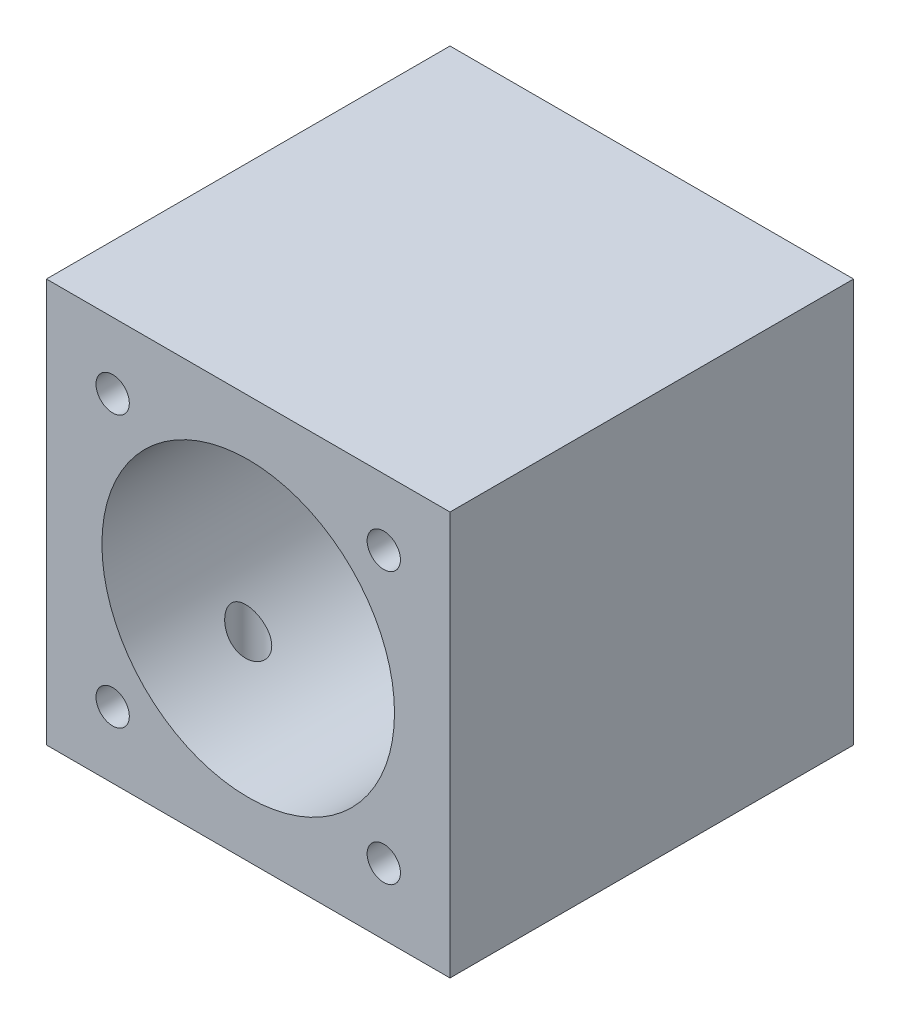
ISO-10303-21;
HEADER;
FILE_DESCRIPTION(('STEP AP214'),'2;1');
FILE_NAME('part.step','',(''),(''),'','','');
FILE_SCHEMA(('AUTOMOTIVE_DESIGN { 1 0 10303 214 1 1 1 1 }'));
ENDSEC;
DATA;
#1=APPLICATION_CONTEXT('core data for automotive mechanical design processes');
#2=APPLICATION_PROTOCOL_DEFINITION('international standard','automotive_design',2000,#1);
#3=PRODUCT_CONTEXT('',#1,'mechanical');
#4=PRODUCT('Part','Part','',(#3));
#5=PRODUCT_RELATED_PRODUCT_CATEGORY('part','',(#4));
#6=PRODUCT_DEFINITION_FORMATION('','',#4);
#7=PRODUCT_DEFINITION_CONTEXT('part definition',#1,'design');
#8=PRODUCT_DEFINITION('design','',#6,#7);
#9=PRODUCT_DEFINITION_SHAPE('','',#8);
#10=(LENGTH_UNIT() NAMED_UNIT(*) SI_UNIT(.MILLI.,.METRE.));
#11=(NAMED_UNIT(*) PLANE_ANGLE_UNIT() SI_UNIT($,.RADIAN.));
#12=(NAMED_UNIT(*) SI_UNIT($,.STERADIAN.) SOLID_ANGLE_UNIT());
#13=UNCERTAINTY_MEASURE_WITH_UNIT(LENGTH_MEASURE(1.E-05),#10,'distance_accuracy_value','');
#14=(GEOMETRIC_REPRESENTATION_CONTEXT(3) GLOBAL_UNCERTAINTY_ASSIGNED_CONTEXT((#13)) GLOBAL_UNIT_ASSIGNED_CONTEXT((#10,
#11,#12)) REPRESENTATION_CONTEXT('',''));
#15=CARTESIAN_POINT('',(0.,0.,0.));
#16=DIRECTION('',(0.,0.,1.));
#17=DIRECTION('',(1.,0.,0.));
#18=AXIS2_PLACEMENT_3D('',#15,#16,#17);
#19=CARTESIAN_POINT('',(0.,0.,40.));
#20=DIRECTION('',(0.,0.,1.));
#21=DIRECTION('',(1.,0.,0.));
#22=AXIS2_PLACEMENT_3D('',#19,#20,#21);
#23=PLANE('',#22);
#24=CARTESIAN_POINT('',(-13.4350288425444,13.4350288425444,40.));
#25=DIRECTION('',(0.,0.,1.));
#26=DIRECTION('',(1.,0.,0.));
#27=AXIS2_PLACEMENT_3D('',#24,#25,#26);
#28=CIRCLE('',#27,1.64999999999999);
#29=CARTESIAN_POINT('',(-11.7850288425444,13.4350288425444,40.));
#30=VERTEX_POINT('',#29);
#31=EDGE_CURVE('E112',#30,#30,#28,.T.);
#32=ORIENTED_EDGE('',*,*,#31,.F.);
#33=EDGE_LOOP('',(#32));
#34=FACE_BOUND('',#33,.T.);
#35=CARTESIAN_POINT('',(13.4350288425444,13.4350288425444,40.));
#36=DIRECTION('',(0.,0.,1.));
#37=DIRECTION('',(1.,0.,0.));
#38=AXIS2_PLACEMENT_3D('',#35,#36,#37);
#39=CIRCLE('',#38,1.64999999999999);
#40=CARTESIAN_POINT('',(15.0850288425444,13.4350288425444,40.));
#41=VERTEX_POINT('',#40);
#42=EDGE_CURVE('E111',#41,#41,#39,.T.);
#43=ORIENTED_EDGE('',*,*,#42,.F.);
#44=EDGE_LOOP('',(#43));
#45=FACE_BOUND('',#44,.T.);
#46=CARTESIAN_POINT('',(13.4350288425444,-13.4350288425444,40.));
#47=DIRECTION('',(0.,0.,1.));
#48=DIRECTION('',(1.,0.,0.));
#49=AXIS2_PLACEMENT_3D('',#46,#47,#48);
#50=CIRCLE('',#49,1.64999999999999);
#51=CARTESIAN_POINT('',(15.0850288425444,-13.4350288425444,40.));
#52=VERTEX_POINT('',#51);
#53=EDGE_CURVE('E124',#52,#52,#50,.T.);
#54=ORIENTED_EDGE('',*,*,#53,.F.);
#55=EDGE_LOOP('',(#54));
#56=FACE_BOUND('',#55,.T.);
#57=CARTESIAN_POINT('',(-13.4350288425444,-13.4350288425444,40.));
#58=DIRECTION('',(0.,0.,1.));
#59=DIRECTION('',(1.,0.,0.));
#60=AXIS2_PLACEMENT_3D('',#57,#58,#59);
#61=CIRCLE('',#60,1.64999999999999);
#62=CARTESIAN_POINT('',(-11.7850288425444,-13.4350288425444,40.));
#63=VERTEX_POINT('',#62);
#64=EDGE_CURVE('E130',#63,#63,#61,.T.);
#65=ORIENTED_EDGE('',*,*,#64,.F.);
#66=EDGE_LOOP('',(#65));
#67=FACE_BOUND('',#66,.T.);
#68=DIRECTION('',(0.,-1.,0.));
#69=VECTOR('',#68,1.);
#70=CARTESIAN_POINT('',(-20.,-20.,40.));
#71=LINE('',#70,#69);
#72=CARTESIAN_POINT('',(-20.,20.,40.));
#73=VERTEX_POINT('',#72);
#74=CARTESIAN_POINT('',(-20.,-20.,40.));
#75=VERTEX_POINT('',#74);
#76=EDGE_CURVE('E143',#73,#75,#71,.T.);
#77=ORIENTED_EDGE('',*,*,#76,.T.);
#78=DIRECTION('',(1.,0.,0.));
#79=VECTOR('',#78,1.);
#80=CARTESIAN_POINT('',(20.,-20.,40.));
#81=LINE('',#80,#79);
#82=CARTESIAN_POINT('',(20.,-20.,40.));
#83=VERTEX_POINT('',#82);
#84=EDGE_CURVE('E88',#75,#83,#81,.T.);
#85=ORIENTED_EDGE('',*,*,#84,.T.);
#86=DIRECTION('',(0.,1.,0.));
#87=VECTOR('',#86,1.);
#88=CARTESIAN_POINT('',(20.,-20.,40.));
#89=LINE('',#88,#87);
#90=CARTESIAN_POINT('',(20.,20.,40.));
#91=VERTEX_POINT('',#90);
#92=EDGE_CURVE('E146',#83,#91,#89,.T.);
#93=ORIENTED_EDGE('',*,*,#92,.T.);
#94=DIRECTION('',(-1.,0.,0.));
#95=VECTOR('',#94,1.);
#96=CARTESIAN_POINT('',(20.,20.,40.));
#97=LINE('',#96,#95);
#98=EDGE_CURVE('E57',#91,#73,#97,.T.);
#99=ORIENTED_EDGE('',*,*,#98,.T.);
#100=EDGE_LOOP('',(#77,#85,#93,#99));
#101=FACE_BOUND('',#100,.T.);
#102=CARTESIAN_POINT('',(0.,0.,40.));
#103=DIRECTION('',(0.,0.,1.));
#104=DIRECTION('',(1.,0.,0.));
#105=AXIS2_PLACEMENT_3D('',#102,#103,#104);
#106=CIRCLE('',#105,14.5);
#107=CARTESIAN_POINT('',(14.5,0.,40.));
#108=VERTEX_POINT('',#107);
#109=EDGE_CURVE('E137',#108,#108,#106,.T.);
#110=ORIENTED_EDGE('',*,*,#109,.F.);
#111=EDGE_LOOP('',(#110));
#112=FACE_BOUND('',#111,.T.);
#113=ADVANCED_FACE('F34',(#34,#45,#56,#67,#101,#112),#23,.T.);
#114=CARTESIAN_POINT('',(0.,0.,0.));
#115=DIRECTION('',(0.,0.,1.));
#116=DIRECTION('',(1.,0.,0.));
#117=AXIS2_PLACEMENT_3D('',#114,#115,#116);
#118=PLANE('',#117);
#119=DIRECTION('',(0.,-1.,0.));
#120=VECTOR('',#119,1.);
#121=CARTESIAN_POINT('',(-20.,-20.,0.));
#122=LINE('',#121,#120);
#123=CARTESIAN_POINT('',(-20.,20.,0.));
#124=VERTEX_POINT('',#123);
#125=CARTESIAN_POINT('',(-20.,-20.,0.));
#126=VERTEX_POINT('',#125);
#127=EDGE_CURVE('E140',#124,#126,#122,.T.);
#128=ORIENTED_EDGE('',*,*,#127,.F.);
#129=DIRECTION('',(-1.,0.,0.));
#130=VECTOR('',#129,1.);
#131=CARTESIAN_POINT('',(20.,20.,0.));
#132=LINE('',#131,#130);
#133=CARTESIAN_POINT('',(20.,20.,0.));
#134=VERTEX_POINT('',#133);
#135=EDGE_CURVE('E81',#134,#124,#132,.T.);
#136=ORIENTED_EDGE('',*,*,#135,.F.);
#137=DIRECTION('',(0.,1.,0.));
#138=VECTOR('',#137,1.);
#139=CARTESIAN_POINT('',(20.,-20.,0.));
#140=LINE('',#139,#138);
#141=CARTESIAN_POINT('',(20.,-20.,0.));
#142=VERTEX_POINT('',#141);
#143=EDGE_CURVE('E75',#142,#134,#140,.T.);
#144=ORIENTED_EDGE('',*,*,#143,.F.);
#145=DIRECTION('',(1.,0.,0.));
#146=VECTOR('',#145,1.);
#147=CARTESIAN_POINT('',(20.,-20.,0.));
#148=LINE('',#147,#146);
#149=EDGE_CURVE('E152',#126,#142,#148,.T.);
#150=ORIENTED_EDGE('',*,*,#149,.F.);
#151=EDGE_LOOP('',(#128,#136,#144,#150));
#152=FACE_BOUND('',#151,.T.);
#153=CARTESIAN_POINT('',(0.,0.,0.));
#154=DIRECTION('',(0.,0.,1.));
#155=DIRECTION('',(1.,0.,0.));
#156=AXIS2_PLACEMENT_3D('',#153,#154,#155);
#157=CIRCLE('',#156,14.5);
#158=CARTESIAN_POINT('',(14.5,0.,0.));
#159=VERTEX_POINT('',#158);
#160=EDGE_CURVE('E136',#159,#159,#157,.T.);
#161=ORIENTED_EDGE('',*,*,#160,.T.);
#162=EDGE_LOOP('',(#161));
#163=FACE_BOUND('',#162,.T.);
#164=ADVANCED_FACE('F212',(#152,#163),#118,.F.);
#165=CARTESIAN_POINT('',(-20.,-20.,40.));
#166=DIRECTION('',(1.,0.,0.));
#167=DIRECTION('',(0.,0.,-1.));
#168=AXIS2_PLACEMENT_3D('',#165,#166,#167);
#169=PLANE('',#168);
#170=ORIENTED_EDGE('',*,*,#127,.T.);
#171=DIRECTION('',(0.,0.,-1.));
#172=VECTOR('',#171,1.);
#173=CARTESIAN_POINT('',(-20.,-20.,40.));
#174=LINE('',#173,#172);
#175=EDGE_CURVE('E11',#75,#126,#174,.T.);
#176=ORIENTED_EDGE('',*,*,#175,.F.);
#177=ORIENTED_EDGE('',*,*,#76,.F.);
#178=DIRECTION('',(0.,0.,-1.));
#179=VECTOR('',#178,1.);
#180=CARTESIAN_POINT('',(-20.,20.,40.));
#181=LINE('',#180,#179);
#182=EDGE_CURVE('E149',#73,#124,#181,.T.);
#183=ORIENTED_EDGE('',*,*,#182,.T.);
#184=EDGE_LOOP('',(#170,#176,#177,#183));
#185=FACE_BOUND('',#184,.T.);
#186=ADVANCED_FACE('F36',(#185),#169,.F.);
#187=CARTESIAN_POINT('',(20.,-20.,40.));
#188=DIRECTION('',(0.,1.,0.));
#189=DIRECTION('',(-1.,0.,0.));
#190=AXIS2_PLACEMENT_3D('',#187,#188,#189);
#191=PLANE('',#190);
#192=CARTESIAN_POINT('',(-9.99999999999999,-20.,30.));
#193=DIRECTION('',(0.,-1.,0.));
#194=DIRECTION('',(0.,0.,-1.));
#195=AXIS2_PLACEMENT_3D('',#192,#193,#194);
#196=CIRCLE('',#195,1.64999999999999);
#197=CARTESIAN_POINT('',(-9.99999999999999,-20.,28.35));
#198=VERTEX_POINT('',#197);
#199=EDGE_CURVE('E236',#198,#198,#196,.T.);
#200=ORIENTED_EDGE('',*,*,#199,.F.);
#201=EDGE_LOOP('',(#200));
#202=FACE_BOUND('',#201,.T.);
#203=CARTESIAN_POINT('',(10.,-20.,30.));
#204=DIRECTION('',(0.,-1.,0.));
#205=DIRECTION('',(0.,0.,-1.));
#206=AXIS2_PLACEMENT_3D('',#203,#204,#205);
#207=CIRCLE('',#206,1.64999999999999);
#208=CARTESIAN_POINT('',(10.,-20.,28.35));
#209=VERTEX_POINT('',#208);
#210=EDGE_CURVE('E240',#209,#209,#207,.T.);
#211=ORIENTED_EDGE('',*,*,#210,.F.);
#212=EDGE_LOOP('',(#211));
#213=FACE_BOUND('',#212,.T.);
#214=CARTESIAN_POINT('',(10.,-20.,10.));
#215=DIRECTION('',(0.,-1.,0.));
#216=DIRECTION('',(0.,0.,-1.));
#217=AXIS2_PLACEMENT_3D('',#214,#215,#216);
#218=CIRCLE('',#217,1.64999999999999);
#219=CARTESIAN_POINT('',(10.,-20.,8.35000000000001));
#220=VERTEX_POINT('',#219);
#221=EDGE_CURVE('E244',#220,#220,#218,.T.);
#222=ORIENTED_EDGE('',*,*,#221,.F.);
#223=EDGE_LOOP('',(#222));
#224=FACE_BOUND('',#223,.T.);
#225=CARTESIAN_POINT('',(-9.99999999999999,-20.,10.));
#226=DIRECTION('',(0.,-1.,0.));
#227=DIRECTION('',(0.,0.,-1.));
#228=AXIS2_PLACEMENT_3D('',#225,#226,#227);
#229=CIRCLE('',#228,1.64999999999999);
#230=CARTESIAN_POINT('',(-9.99999999999999,-20.,8.35000000000001));
#231=VERTEX_POINT('',#230);
#232=EDGE_CURVE('E165',#231,#231,#229,.T.);
#233=ORIENTED_EDGE('',*,*,#232,.F.);
#234=EDGE_LOOP('',(#233));
#235=FACE_BOUND('',#234,.T.);
#236=ORIENTED_EDGE('',*,*,#149,.T.);
#237=DIRECTION('',(0.,0.,-1.));
#238=VECTOR('',#237,1.);
#239=CARTESIAN_POINT('',(20.,-20.,40.));
#240=LINE('',#239,#238);
#241=EDGE_CURVE('E48',#83,#142,#240,.T.);
#242=ORIENTED_EDGE('',*,*,#241,.F.);
#243=ORIENTED_EDGE('',*,*,#84,.F.);
#244=ORIENTED_EDGE('',*,*,#175,.T.);
#245=EDGE_LOOP('',(#236,#242,#243,#244));
#246=FACE_BOUND('',#245,.T.);
#247=ADVANCED_FACE('F226',(#202,#213,#224,#235,#246),#191,.F.);
#248=CARTESIAN_POINT('',(20.,-20.,40.));
#249=DIRECTION('',(-1.,0.,0.));
#250=DIRECTION('',(0.,0.,1.));
#251=AXIS2_PLACEMENT_3D('',#248,#249,#250);
#252=PLANE('',#251);
#253=ORIENTED_EDGE('',*,*,#143,.T.);
#254=DIRECTION('',(0.,0.,-1.));
#255=VECTOR('',#254,1.);
#256=CARTESIAN_POINT('',(20.,20.,40.));
#257=LINE('',#256,#255);
#258=EDGE_CURVE('E157',#91,#134,#257,.T.);
#259=ORIENTED_EDGE('',*,*,#258,.F.);
#260=ORIENTED_EDGE('',*,*,#92,.F.);
#261=ORIENTED_EDGE('',*,*,#241,.T.);
#262=EDGE_LOOP('',(#253,#259,#260,#261));
#263=FACE_BOUND('',#262,.T.);
#264=ADVANCED_FACE('F224',(#263),#252,.F.);
#265=CARTESIAN_POINT('',(20.,20.,40.));
#266=DIRECTION('',(0.,-1.,0.));
#267=DIRECTION('',(1.,0.,0.));
#268=AXIS2_PLACEMENT_3D('',#265,#266,#267);
#269=PLANE('',#268);
#270=ORIENTED_EDGE('',*,*,#135,.T.);
#271=ORIENTED_EDGE('',*,*,#182,.F.);
#272=ORIENTED_EDGE('',*,*,#98,.F.);
#273=ORIENTED_EDGE('',*,*,#258,.T.);
#274=EDGE_LOOP('',(#270,#271,#272,#273));
#275=FACE_BOUND('',#274,.T.);
#276=ADVANCED_FACE('F208',(#275),#269,.F.);
#277=CARTESIAN_POINT('',(0.,0.,40.));
#278=DIRECTION('',(0.,0.,-1.));
#279=DIRECTION('',(-1.,0.,0.));
#280=AXIS2_PLACEMENT_3D('',#277,#278,#279);
#281=CYLINDRICAL_SURFACE('',#280,14.5);
#282=CARTESIAN_POINT('',(-9.99999999999999,-10.5,28.35));
#283=CARTESIAN_POINT('',(-10.1313534560671,-10.3748929121296,28.349995807328));
#284=CARTESIAN_POINT('',(-10.260506336877,-10.2471379112481,28.36564001975));
#285=CARTESIAN_POINT('',(-10.4480658163352,-10.054654863528,28.4106945426634));
#286=CARTESIAN_POINT('',(-10.5096729191813,-9.99022393603448,28.429369147471));
#287=CARTESIAN_POINT('',(-10.6304712227531,-9.86158468853992,28.4738468208631));
#288=CARTESIAN_POINT('',(-10.689663202446,-9.79737630297366,28.4996475698041));
#289=CARTESIAN_POINT('',(-10.8429000826233,-9.62816807877147,28.5775035449051));
#290=CARTESIAN_POINT('',(-10.934616446082,-9.52375580876354,28.6357278032631));
#291=CARTESIAN_POINT('',(-11.0647771122063,-9.37151002497984,28.7383409535363));
#292=CARTESIAN_POINT('',(-11.1068943759035,-9.32153247007461,28.77505226862));
#293=CARTESIAN_POINT('',(-11.1883325525917,-9.22362474750031,28.8538860815675));
#294=CARTESIAN_POINT('',(-11.2276550175896,-9.17569344950437,28.8960055391267));
#295=CARTESIAN_POINT('',(-11.3102501322488,-9.07377123632893,28.994689643744));
#296=CARTESIAN_POINT('',(-11.3528308105908,-9.02038472582194,29.0524749476392));
#297=CARTESIAN_POINT('',(-11.4319810234612,-8.9198591336061,29.1769818928109));
#298=CARTESIAN_POINT('',(-11.468557439587,-8.87271291196565,29.2436931423872));
#299=CARTESIAN_POINT('',(-11.5262164404264,-8.7976158257526,29.3700687219737));
#300=CARTESIAN_POINT('',(-11.5489280172526,-8.76774349535401,29.4278302347267));
#301=CARTESIAN_POINT('',(-11.5883248426558,-8.7156065864995,29.5486246769218));
#302=CARTESIAN_POINT('',(-11.6050196526374,-8.69332994060341,29.6116490449194));
#303=CARTESIAN_POINT('',(-11.628824099162,-8.66145372662411,29.7307942784749));
#304=CARTESIAN_POINT('',(-11.6370779964464,-8.65034642596195,29.7862774507427));
#305=CARTESIAN_POINT('',(-11.6478595234522,-8.63582390704461,29.8987852516419));
#306=CARTESIAN_POINT('',(-11.6503912373791,-8.63240320249523,29.9558087514285));
#307=CARTESIAN_POINT('',(-11.6495096163091,-8.63359286513653,30.0697716814279));
#308=CARTESIAN_POINT('',(-11.6460912446196,-8.63821003631518,30.1267109995424));
#309=CARTESIAN_POINT('',(-11.6336017955209,-8.65502251350994,30.2388209083442));
#310=CARTESIAN_POINT('',(-11.6245263724234,-8.66722364542593,30.2939901049524));
#311=CARTESIAN_POINT('',(-11.5984189700136,-8.70214108714271,30.4151086605549));
#312=CARTESIAN_POINT('',(-11.5799434814787,-8.72675147143607,30.4801947782875));
#313=CARTESIAN_POINT('',(-11.53668456798,-8.78385981504646,30.6045308455615));
#314=CARTESIAN_POINT('',(-11.5118891022035,-8.81637282488843,30.6637693519878));
#315=CARTESIAN_POINT('',(-11.4443208797032,-8.9040350338838,30.8031053343217));
#316=CARTESIAN_POINT('',(-11.3986222341864,-8.96257284347811,30.8796265575708));
#317=CARTESIAN_POINT('',(-11.2994732889218,-9.08725983698019,31.0204472935056));
#318=CARTESIAN_POINT('',(-11.2460051428112,-9.15342646981708,31.0847178589464));
#319=CARTESIAN_POINT('',(-11.1467658182103,-9.27384287089452,31.1879543229597));
#320=CARTESIAN_POINT('',(-11.1022405852095,-9.3271266280121,31.2292871786413));
#321=CARTESIAN_POINT('',(-11.0102768216306,-9.43551108489908,31.3059189682508));
#322=CARTESIAN_POINT('',(-10.9628368630095,-9.4906126690749,31.3412149118858));
#323=CARTESIAN_POINT('',(-10.8166927937708,-9.65768935291422,31.4384834089456));
#324=CARTESIAN_POINT('',(-10.7141650280903,-9.77143572568704,31.491836086518));
#325=CARTESIAN_POINT('',(-10.4979642017254,-10.0034372902677,31.5774888476801));
#326=CARTESIAN_POINT('',(-10.3840402698714,-10.1217207603144,31.6090648136381));
#327=CARTESIAN_POINT('',(-10.1501153702954,-10.3562784648021,31.647417612389));
#328=CARTESIAN_POINT('',(-10.0301189882861,-10.4725541290325,31.6542128835564));
#329=CARTESIAN_POINT('',(-9.80312711209082,-10.6850172099504,31.6416110489514));
#330=CARTESIAN_POINT('',(-9.69652522524002,-10.7818195006348,31.6255774687863));
#331=CARTESIAN_POINT('',(-9.48373974788325,-10.9694433545674,31.5709885881548));
#332=CARTESIAN_POINT('',(-9.37755581642032,-11.0602716975654,31.5324593261561));
#333=CARTESIAN_POINT('',(-9.19318007306565,-11.2136738430684,31.4420784954505));
#334=CARTESIAN_POINT('',(-9.11405089973932,-11.2780160894474,31.3951521518848));
#335=CARTESIAN_POINT('',(-8.96143569245347,-11.3996554084776,31.2855657014007));
#336=CARTESIAN_POINT('',(-8.88794254523192,-11.456961418433,31.2229258679607));
#337=CARTESIAN_POINT('',(-8.76259497432695,-11.5530093445749,31.0944733753396));
#338=CARTESIAN_POINT('',(-8.70922586004236,-11.5932364671774,31.0312565484967));
#339=CARTESIAN_POINT('',(-8.61105294692059,-11.6663409591111,30.8946443664425));
#340=CARTESIAN_POINT('',(-8.56624678419028,-11.6992203572849,30.8212518300247));
#341=CARTESIAN_POINT('',(-8.48742013678742,-11.756534691528,30.6650596131805));
#342=CARTESIAN_POINT('',(-8.45347923264864,-11.7809074343665,30.582196297659));
#343=CARTESIAN_POINT('',(-8.39918906456334,-11.819676694643,30.4099242508354));
#344=CARTESIAN_POINT('',(-8.37882938262353,-11.8340808591769,30.3205205951064));
#345=CARTESIAN_POINT('',(-8.35487211852886,-11.8510038911826,30.1500377020687));
#346=CARTESIAN_POINT('',(-8.34948338478091,-11.8547932986892,30.0693318441418));
#347=CARTESIAN_POINT('',(-8.35059406903307,-11.8540112490697,29.908058522355));
#348=CARTESIAN_POINT('',(-8.35708885683576,-11.8494430483331,29.8274910168308));
#349=CARTESIAN_POINT('',(-8.38085152463741,-11.8326462532665,29.6735234934566));
#350=CARTESIAN_POINT('',(-8.39749154850319,-11.8208639479565,29.5999754436561));
#351=CARTESIAN_POINT('',(-8.44008214933267,-11.7904916248143,29.457124835349));
#352=CARTESIAN_POINT('',(-8.46603356429155,-11.7719009942517,29.3878226596149));
#353=CARTESIAN_POINT('',(-8.52738144329922,-11.7275425847517,29.2518619346763));
#354=CARTESIAN_POINT('',(-8.56315628971047,-11.7014849062039,29.18547013473));
#355=CARTESIAN_POINT('',(-8.64191692831924,-11.6434386440478,29.0599973668147));
#356=CARTESIAN_POINT('',(-8.68490485639392,-11.6114483034133,29.0009185733425));
#357=CARTESIAN_POINT('',(-8.78234051767101,-11.537966139561,28.8836057598026));
#358=CARTESIAN_POINT('',(-8.83755059926806,-11.4957827960829,28.8264413221056));
#359=CARTESIAN_POINT('',(-8.95303665529197,-11.4060731369782,28.7223354436366));
#360=CARTESIAN_POINT('',(-9.01331751790033,-11.3585416505476,28.6754040275886));
#361=CARTESIAN_POINT('',(-9.1668314122736,-11.2353419769045,28.5715214870254));
#362=CARTESIAN_POINT('',(-9.26203299949206,-11.1570912011518,28.5205172441848));
#363=CARTESIAN_POINT('',(-9.45523924227657,-10.9938392511289,28.4389878066148));
#364=CARTESIAN_POINT('',(-9.55324594170599,-10.9088330702606,28.4084779621027));
#365=CARTESIAN_POINT('',(-9.70965602602255,-10.7693436268075,28.3746431790344));
#366=CARTESIAN_POINT('',(-9.76815169709958,-10.7163178119523,28.3653211029514));
#367=CARTESIAN_POINT('',(-9.88457190998073,-10.6090298945979,28.3530026316211));
#368=CARTESIAN_POINT('',(-9.94249682116954,-10.5547686788165,28.3500018354444));
#369=CARTESIAN_POINT('',(-9.99999999999999,-10.5,28.35));
#370=B_SPLINE_CURVE_WITH_KNOTS('',3,(#282,#283,#284,#285,#286,#287,#288,#289,#290,#291,#292,
#293,#294,#295,#296,#297,#298,#299,#300,#301,#302,#303,#304,#305,#306,#307,#308,#309,#310,#311,
#312,#313,#314,#315,#316,#317,#318,#319,#320,#321,#322,#323,#324,#325,#326,#327,#328,#329,#330,
#331,#332,#333,#334,#335,#336,#337,#338,#339,#340,#341,#342,#343,#344,#345,#346,#347,#348,#349,
#350,#351,#352,#353,#354,#355,#356,#357,#358,#359,#360,#361,#362,#363,#364,#365,#366,#367,#368,
#369),.UNSPECIFIED.,.T.,.F.,(4,2,2,2,2,2,2,2,2,2,2,2,2,2,2,2,2,2,2,2,2,2,2,2,2,2,2,2,2,2,2,2,2,
2,2,2,2,2,2,2,2,2,2,4),(0.,0.543849927041509,0.816855889789977,1.08977309041768,
1.53991986891442,1.76459623713484,1.98914684717768,2.25682775357271,2.52419969088196,
2.73013738128158,2.93574635238039,3.10654542650278,3.27722255431773,3.44804422901369,
3.61899728914626,3.83378660850012,4.04898824354593,4.36712714215674,4.68600870136118,
4.92812046835044,5.17035181658486,5.65481750267102,6.15470292621915,6.65421632801639,
7.0872915585122,7.51986650088733,7.85543459109801,8.19057193970115,8.46544722133479,
8.74024651078633,9.01701475942466,9.2935704575545,9.53522406869077,9.77678354395452,
10.00472758732,10.2326921500622,10.4711050973841,10.7095887665348,10.9785011925596,
11.2476758852197,11.6456181831186,12.0438582067562,12.2821077019263,12.5201912708552),.UNSPECIFIED.);
#371=CARTESIAN_POINT('',(-9.99999999999999,-10.5,28.35));
#372=VERTEX_POINT('',#371);
#373=EDGE_CURVE('E38',#372,#372,#370,.T.);
#374=ORIENTED_EDGE('',*,*,#373,.F.);
#375=EDGE_LOOP('',(#374));
#376=FACE_BOUND('',#375,.T.);
#377=CARTESIAN_POINT('',(10.,-10.5,28.35));
#378=CARTESIAN_POINT('',(9.89906355246964,-10.5961278649743,28.3499981293684));
#379=CARTESIAN_POINT('',(9.79666636373933,-10.6908575636549,28.3592409355271));
#380=CARTESIAN_POINT('',(9.59118312829886,-10.8755814573253,28.3980330881064));
#381=CARTESIAN_POINT('',(9.48809672852622,-10.9655729756681,28.4275937825722));
#382=CARTESIAN_POINT('',(9.30120940420258,-11.1242987660684,28.5024651947742));
#383=CARTESIAN_POINT('',(9.21699731716002,-11.1941106637538,28.5444348732653));
#384=CARTESIAN_POINT('',(9.05334820547413,-11.3268678810045,28.6451745022974));
#385=CARTESIAN_POINT('',(8.97390426419137,-11.3898232602329,28.7039193693205));
#386=CARTESIAN_POINT('',(8.83737728188838,-11.4959483796552,28.8262915068379));
#387=CARTESIAN_POINT('',(8.77887341025109,-11.5406253235074,28.8870165133902));
#388=CARTESIAN_POINT('',(8.66996970565546,-11.6226618766746,29.0197566576833));
#389=CARTESIAN_POINT('',(8.6195683023393,-11.6600229042107,29.0917696023265));
#390=CARTESIAN_POINT('',(8.52928181625358,-11.7262324626313,29.2466213046081));
#391=CARTESIAN_POINT('',(8.48948441580501,-11.7550102400862,29.3295423384023));
#392=CARTESIAN_POINT('',(8.42375218239185,-11.8022058034766,29.5034564838577));
#393=CARTESIAN_POINT('',(8.39780418749507,-11.8206334266679,29.5944418352497));
#394=CARTESIAN_POINT('',(8.3643510640268,-11.8443229854172,29.7679584159931));
#395=CARTESIAN_POINT('',(8.35477449322644,-11.8510655188151,29.8498929182392));
#396=CARTESIAN_POINT('',(8.34801255694877,-11.8558302040424,30.0145092391785));
#397=CARTESIAN_POINT('',(8.35082096429988,-11.8538567382787,30.0971906614545));
#398=CARTESIAN_POINT('',(8.36795583295574,-11.8417653219188,30.2543924190398));
#399=CARTESIAN_POINT('',(8.38140312497059,-11.8322689676459,30.329059923973));
#400=CARTESIAN_POINT('',(8.41797501118093,-11.8062778205263,30.474693573554));
#401=CARTESIAN_POINT('',(8.44109970394397,-11.7897829563975,30.5456596804936));
#402=CARTESIAN_POINT('',(8.49671483809474,-11.7497675728579,30.6843913310647));
#403=CARTESIAN_POINT('',(8.52947136600004,-11.7260466450792,30.7519913967759));
#404=CARTESIAN_POINT('',(8.60252224583136,-11.6725600418303,30.8803502837826));
#405=CARTESIAN_POINT('',(8.642819015711,-11.6427924270869,30.9411069005276));
#406=CARTESIAN_POINT('',(8.7344139522734,-11.5742661843883,31.0616815580825));
#407=CARTESIAN_POINT('',(8.78644593274628,-11.5348652967903,31.1205742263295));
#408=CARTESIAN_POINT('',(8.89592943012881,-11.4506432151443,31.2285992576163));
#409=CARTESIAN_POINT('',(8.95338459822914,-11.4058183635751,31.2777249748769));
#410=CARTESIAN_POINT('',(9.09936437822526,-11.2899835131658,31.3867401516155));
#411=CARTESIAN_POINT('',(9.18999430401796,-11.2164334102908,31.441139993847));
#412=CARTESIAN_POINT('',(9.37488593732675,-11.0623731553973,31.5304641911963));
#413=CARTESIAN_POINT('',(9.46915453282828,-10.9818494041043,31.5653494563903));
#414=CARTESIAN_POINT('',(9.68483720112459,-10.7925807028893,31.6244824253084));
#415=CARTESIAN_POINT('',(9.80643934978857,-10.6822613669654,31.6429907780145));
#416=CARTESIAN_POINT('',(10.0463549241804,-10.4569571549891,31.6537243348865));
#417=CARTESIAN_POINT('',(10.1646651105816,-10.3419679395352,31.6459245137752));
#418=CARTESIAN_POINT('',(10.3969442943044,-10.1084654219141,31.6059361775933));
#419=CARTESIAN_POINT('',(10.5108233458495,-9.98992515394598,31.5733890915712));
#420=CARTESIAN_POINT('',(10.7301412214162,-9.7539707205193,31.4843890121389));
#421=CARTESIAN_POINT('',(10.8355833379225,-9.63655613166892,31.427945398899));
#422=CARTESIAN_POINT('',(11.0116678113931,-9.43433508417225,31.3067394281384));
#423=CARTESIAN_POINT('',(11.0846181655475,-9.34842126684168,31.2471579677022));
#424=CARTESIAN_POINT('',(11.2224467751954,-9.18249490272249,31.1123867687343));
#425=CARTESIAN_POINT('',(11.2873394545123,-9.10247191864053,31.0372255824183));
#426=CARTESIAN_POINT('',(11.3856205107373,-8.97895283336629,30.8983757669309));
#427=CARTESIAN_POINT('',(11.4221560876789,-8.93237678245621,30.8396688728517));
#428=CARTESIAN_POINT('',(11.4891094729002,-8.84609082536875,30.7142078517634));
#429=CARTESIAN_POINT('',(11.5195366489324,-8.80637041880493,30.6474663019905));
#430=CARTESIAN_POINT('',(11.5661275149,-8.74504565355478,30.5225729301377));
#431=CARTESIAN_POINT('',(11.5839627945687,-8.72137722714519,30.4660729308482));
#432=CARTESIAN_POINT('',(11.613797848844,-8.68160818121715,30.3489895757815));
#433=CARTESIAN_POINT('',(11.6258037779139,-8.6654995808521,30.2884106037753));
#434=CARTESIAN_POINT('',(11.6430389698618,-8.64232978543017,30.1639910326855));
#435=CARTESIAN_POINT('',(11.6482084037477,-8.63534847301117,30.1001266542785));
#436=CARTESIAN_POINT('',(11.6510046613419,-8.63157570430101,29.971936896179));
#437=CARTESIAN_POINT('',(11.6486343986189,-8.63478031185961,29.907611704144));
#438=CARTESIAN_POINT('',(11.6374036928083,-8.64990756503814,29.7890472559779));
#439=CARTESIAN_POINT('',(11.6294088012107,-8.66066720846126,29.7345673040162));
#440=CARTESIAN_POINT('',(11.6085023256947,-8.68866956439338,29.628305127725));
#441=CARTESIAN_POINT('',(11.5955882281746,-8.70591559123876,29.5765242979886));
#442=CARTESIAN_POINT('',(11.5588373616149,-8.75468838595172,29.4538620086981));
#443=CARTESIAN_POINT('',(11.5326997930629,-8.78915041707347,29.3848428246363));
#444=CARTESIAN_POINT('',(11.4737330296732,-8.86599186050962,29.2545096110636));
#445=CARTESIAN_POINT('',(11.4408875720845,-8.90839049324895,29.1932149042999));
#446=CARTESIAN_POINT('',(11.3512578338109,-9.02256017293173,29.0474600380928));
#447=CARTESIAN_POINT('',(11.2910268829565,-9.09796790853729,28.9679959358193));
#448=CARTESIAN_POINT('',(11.1619657146683,-9.25586340273855,28.8245559030744));
#449=CARTESIAN_POINT('',(11.0931135352771,-9.33836906853664,28.7606208001858));
#450=CARTESIAN_POINT('',(10.9696931139399,-9.48272500731506,28.6634232890762));
#451=CARTESIAN_POINT('',(10.9167574365065,-9.54364311502647,28.6266388701017));
#452=CARTESIAN_POINT('',(10.8079827346068,-9.66665788522529,28.5599519263302));
#453=CARTESIAN_POINT('',(10.7521423197448,-9.72875510291134,28.5300527351087));
#454=CARTESIAN_POINT('',(10.5810263797443,-9.91565472928465,28.450576322809));
#455=CARTESIAN_POINT('',(10.4618749868305,-10.0413961359539,28.4110039658122));
#456=CARTESIAN_POINT('',(10.2839502669411,-10.2223600840361,28.3736394741579));
#457=CARTESIAN_POINT('',(10.2279935599864,-10.2783491984508,28.3648383940097));
#458=CARTESIAN_POINT('',(10.1148501207032,-10.3897109665459,28.3530192853793));
#459=CARTESIAN_POINT('',(10.0576634284724,-10.4450836402333,28.3500010686629));
#460=CARTESIAN_POINT('',(10.,-10.5,28.35));
#461=B_SPLINE_CURVE_WITH_KNOTS('',3,(#377,#378,#379,#380,#381,#382,#383,#384,#385,#386,#387,
#388,#389,#390,#391,#392,#393,#394,#395,#396,#397,#398,#399,#400,#401,#402,#403,#404,#405,#406,
#407,#408,#409,#410,#411,#412,#413,#414,#415,#416,#417,#418,#419,#420,#421,#422,#423,#424,#425,
#426,#427,#428,#429,#430,#431,#432,#433,#434,#435,#436,#437,#438,#439,#440,#441,#442,#443,#444,
#445,#446,#447,#448,#449,#450,#451,#452,#453,#454,#455,#456,#457,#458,#459,#460),.UNSPECIFIED.,
.T.,.F.,(4,2,2,2,2,2,2,2,2,2,2,2,2,2,2,2,2,2,2,2,2,2,2,2,2,2,2,2,2,2,2,2,2,2,2,2,2,2,2,2,2,4),
(0.,0.41795087101804,0.836135367870383,1.18634718305643,1.53603805301876,1.82118764917837,
2.10628191304364,2.39366513997266,2.68077476063289,2.92773983070691,3.17458074081429,
3.40291854892157,3.63125868278242,3.86661899919463,4.10205491910222,4.36478506323882,
4.62769337099082,5.01188959087462,5.39685266878672,5.88993461985661,6.3834857403675,
6.88432766297107,7.38497317071196,7.76641036370122,8.14715459940072,8.3966014141597,
8.64566270849842,8.83636324202887,9.02686199916229,9.21901709376489,9.41109794280519,
9.57870142780361,9.74639066947621,9.98936865457566,10.2329428670664,10.6059374104997,
10.9799022360591,11.2456445153456,11.5115151880748,12.0418173630315,12.2805939919271,
12.5193628484266),.UNSPECIFIED.);
#462=CARTESIAN_POINT('',(10.,-10.5,28.35));
#463=VERTEX_POINT('',#462);
#464=EDGE_CURVE('E261',#463,#463,#461,.T.);
#465=ORIENTED_EDGE('',*,*,#464,.F.);
#466=EDGE_LOOP('',(#465));
#467=FACE_BOUND('',#466,.T.);
#468=CARTESIAN_POINT('',(10.,-10.5,8.35000000000001));
#469=CARTESIAN_POINT('',(9.89906355246964,-10.5961278649743,8.34999812936842));
#470=CARTESIAN_POINT('',(9.79666636373933,-10.6908575636549,8.35924093552715));
#471=CARTESIAN_POINT('',(9.59118312829886,-10.8755814573253,8.39803308810644));
#472=CARTESIAN_POINT('',(9.48809672852623,-10.9655729756681,8.42759378257221));
#473=CARTESIAN_POINT('',(9.30120940420259,-11.1242987660684,8.50246519477422));
#474=CARTESIAN_POINT('',(9.21699731716002,-11.1941106637538,8.54443487326531));
#475=CARTESIAN_POINT('',(9.05334820547413,-11.3268678810045,8.64517450229745));
#476=CARTESIAN_POINT('',(8.97390426419137,-11.3898232602329,8.70391936932053));
#477=CARTESIAN_POINT('',(8.83737728188838,-11.4959483796552,8.8262915068379));
#478=CARTESIAN_POINT('',(8.77887341025109,-11.5406253235074,8.88701651339024));
#479=CARTESIAN_POINT('',(8.66996970565546,-11.6226618766746,9.01975665768327));
#480=CARTESIAN_POINT('',(8.6195683023393,-11.6600229042107,9.09176960232646));
#481=CARTESIAN_POINT('',(8.52928181625358,-11.7262324626313,9.24662130460806));
#482=CARTESIAN_POINT('',(8.489484415805,-11.7550102400862,9.32954233840234));
#483=CARTESIAN_POINT('',(8.42375218239185,-11.8022058034766,9.50345648385774));
#484=CARTESIAN_POINT('',(8.39780418749507,-11.8206334266679,9.59444183524971));
#485=CARTESIAN_POINT('',(8.3643510640268,-11.8443229854172,9.76795841599308));
#486=CARTESIAN_POINT('',(8.35477449322644,-11.8510655188151,9.84989291823925));
#487=CARTESIAN_POINT('',(8.34801255694877,-11.8558302040424,10.0145092391785));
#488=CARTESIAN_POINT('',(8.35082096429988,-11.8538567382787,10.0971906614545));
#489=CARTESIAN_POINT('',(8.36795583295574,-11.8417653219188,10.2543924190398));
#490=CARTESIAN_POINT('',(8.3814031249706,-11.8322689676459,10.329059923973));
#491=CARTESIAN_POINT('',(8.41797501118093,-11.8062778205263,10.474693573554));
#492=CARTESIAN_POINT('',(8.44109970394397,-11.7897829563975,10.5456596804936));
#493=CARTESIAN_POINT('',(8.49671483809474,-11.7497675728579,10.6843913310648));
#494=CARTESIAN_POINT('',(8.52947136600004,-11.7260466450792,10.7519913967759));
#495=CARTESIAN_POINT('',(8.60252224583136,-11.6725600418303,10.8803502837826));
#496=CARTESIAN_POINT('',(8.64281901571101,-11.6427924270869,10.9411069005276));
#497=CARTESIAN_POINT('',(8.7344139522734,-11.5742661843883,11.0616815580825));
#498=CARTESIAN_POINT('',(8.78644593274629,-11.5348652967903,11.1205742263295));
#499=CARTESIAN_POINT('',(8.89592943012882,-11.4506432151443,11.2285992576163));
#500=CARTESIAN_POINT('',(8.95338459822915,-11.4058183635751,11.2777249748769));
#501=CARTESIAN_POINT('',(9.09936437822526,-11.2899835131658,11.3867401516155));
#502=CARTESIAN_POINT('',(9.18999430401796,-11.2164334102908,11.441139993847));
#503=CARTESIAN_POINT('',(9.37488593732675,-11.0623731553973,11.5304641911963));
#504=CARTESIAN_POINT('',(9.46915453282829,-10.9818494041043,11.5653494563903));
#505=CARTESIAN_POINT('',(9.68483720112459,-10.7925807028893,11.6244824253084));
#506=CARTESIAN_POINT('',(9.80643934978858,-10.6822613669654,11.6429907780145));
#507=CARTESIAN_POINT('',(10.0463549241804,-10.4569571549891,11.6537243348865));
#508=CARTESIAN_POINT('',(10.1646651105816,-10.3419679395352,11.6459245137752));
#509=CARTESIAN_POINT('',(10.3969442943045,-10.1084654219141,11.6059361775933));
#510=CARTESIAN_POINT('',(10.5108233458495,-9.98992515394597,11.5733890915712));
#511=CARTESIAN_POINT('',(10.7301412214163,-9.75397072051929,11.4843890121389));
#512=CARTESIAN_POINT('',(10.8355833379225,-9.63655613166891,11.427945398899));
#513=CARTESIAN_POINT('',(11.0116678113931,-9.43433508417224,11.3067394281384));
#514=CARTESIAN_POINT('',(11.0846181655475,-9.34842126684167,11.2471579677022));
#515=CARTESIAN_POINT('',(11.2224467751954,-9.18249490272248,11.1123867687343));
#516=CARTESIAN_POINT('',(11.2873394545123,-9.10247191864052,11.0372255824183));
#517=CARTESIAN_POINT('',(11.3856205107373,-8.97895283336628,10.8983757669309));
#518=CARTESIAN_POINT('',(11.4221560876789,-8.9323767824562,10.8396688728517));
#519=CARTESIAN_POINT('',(11.4891094729002,-8.84609082536874,10.7142078517634));
#520=CARTESIAN_POINT('',(11.5195366489324,-8.80637041880493,10.6474663019905));
#521=CARTESIAN_POINT('',(11.5661275149,-8.74504565355478,10.5225729301377));
#522=CARTESIAN_POINT('',(11.5839627945687,-8.72137722714518,10.4660729308482));
#523=CARTESIAN_POINT('',(11.613797848844,-8.68160818121714,10.3489895757815));
#524=CARTESIAN_POINT('',(11.6258037779139,-8.6654995808521,10.2884106037753));
#525=CARTESIAN_POINT('',(11.6430389698618,-8.64232978543017,10.1639910326855));
#526=CARTESIAN_POINT('',(11.6482084037477,-8.63534847301117,10.1001266542785));
#527=CARTESIAN_POINT('',(11.6510046613419,-8.63157570430101,9.97193689617895));
#528=CARTESIAN_POINT('',(11.6486343986189,-8.63478031185961,9.90761170414405));
#529=CARTESIAN_POINT('',(11.6374036928083,-8.64990756503815,9.78904725597793));
#530=CARTESIAN_POINT('',(11.6294088012107,-8.66066720846126,9.73456730401619));
#531=CARTESIAN_POINT('',(11.6085023256947,-8.68866956439338,9.628305127725));
#532=CARTESIAN_POINT('',(11.5955882281746,-8.70591559123876,9.57652429798861));
#533=CARTESIAN_POINT('',(11.5588373616149,-8.75468838595172,9.45386200869806));
#534=CARTESIAN_POINT('',(11.5326997930629,-8.78915041707347,9.38484282463632));
#535=CARTESIAN_POINT('',(11.4737330296732,-8.86599186050963,9.25450961106359));
#536=CARTESIAN_POINT('',(11.4408875720845,-8.90839049324895,9.19321490429985));
#537=CARTESIAN_POINT('',(11.3512578338109,-9.02256017293174,9.0474600380928));
#538=CARTESIAN_POINT('',(11.2910268829565,-9.0979679085373,8.96799593581932));
#539=CARTESIAN_POINT('',(11.1619657146683,-9.25586340273856,8.8245559030744));
#540=CARTESIAN_POINT('',(11.0931135352771,-9.33836906853664,8.76062080018578));
#541=CARTESIAN_POINT('',(10.9696931139399,-9.48272500731507,8.66342328907616));
#542=CARTESIAN_POINT('',(10.9167574365065,-9.54364311502647,8.62663887010172));
#543=CARTESIAN_POINT('',(10.8079827346068,-9.66665788522529,8.55995192633024));
#544=CARTESIAN_POINT('',(10.7521423197447,-9.72875510291135,8.53005273510867));
#545=CARTESIAN_POINT('',(10.5810263797443,-9.91565472928466,8.45057632280903));
#546=CARTESIAN_POINT('',(10.4618749868305,-10.0413961359539,8.4110039658122));
#547=CARTESIAN_POINT('',(10.2839502669411,-10.2223600840361,8.37363947415786));
#548=CARTESIAN_POINT('',(10.2279935599864,-10.2783491984508,8.36483839400969));
#549=CARTESIAN_POINT('',(10.1148501207032,-10.3897109665459,8.35301928537932));
#550=CARTESIAN_POINT('',(10.0576634284724,-10.4450836402333,8.35000106866286));
#551=CARTESIAN_POINT('',(10.,-10.5,8.35000000000001));
#552=B_SPLINE_CURVE_WITH_KNOTS('',3,(#468,#469,#470,#471,#472,#473,#474,#475,#476,#477,#478,
#479,#480,#481,#482,#483,#484,#485,#486,#487,#488,#489,#490,#491,#492,#493,#494,#495,#496,#497,
#498,#499,#500,#501,#502,#503,#504,#505,#506,#507,#508,#509,#510,#511,#512,#513,#514,#515,#516,
#517,#518,#519,#520,#521,#522,#523,#524,#525,#526,#527,#528,#529,#530,#531,#532,#533,#534,#535,
#536,#537,#538,#539,#540,#541,#542,#543,#544,#545,#546,#547,#548,#549,#550,#551),.UNSPECIFIED.,
.T.,.F.,(4,2,2,2,2,2,2,2,2,2,2,2,2,2,2,2,2,2,2,2,2,2,2,2,2,2,2,2,2,2,2,2,2,2,2,2,2,2,2,2,2,4),
(0.,0.41795087101804,0.836135367870383,1.18634718305642,1.53603805301876,1.82118764917837,
2.10628191304364,2.39366513997267,2.68077476063289,2.92773983070692,3.1745807408143,
3.40291854892159,3.63125868278243,3.86661899919463,4.10205491910223,4.36478506323883,
4.62769337099084,5.01188959087463,5.39685266878673,5.88993461985662,6.38348574036751,
6.88432766297108,7.38497317071197,7.76641036370123,8.14715459940073,8.39660141415971,
8.64566270849842,8.83636324202888,9.02686199916229,9.21901709376489,9.41109794280519,
9.5787014278036,9.74639066947621,9.98936865457566,10.2329428670664,10.6059374104997,
10.9799022360591,11.2456445153456,11.5115151880749,12.0418173630315,12.2805939919271,
12.5193628484266),.UNSPECIFIED.);
#553=CARTESIAN_POINT('',(10.,-10.5,8.35000000000001));
#554=VERTEX_POINT('',#553);
#555=EDGE_CURVE('E166',#554,#554,#552,.T.);
#556=ORIENTED_EDGE('',*,*,#555,.F.);
#557=EDGE_LOOP('',(#556));
#558=FACE_BOUND('',#557,.T.);
#559=CARTESIAN_POINT('',(-9.99999999999999,-10.5,8.35000000000001));
#560=CARTESIAN_POINT('',(-10.1313534560671,-10.3748929121296,8.34999580732804));
#561=CARTESIAN_POINT('',(-10.260506336877,-10.2471379112481,8.36564001974997));
#562=CARTESIAN_POINT('',(-10.4480658163352,-10.054654863528,8.41069454266342));
#563=CARTESIAN_POINT('',(-10.5096729191813,-9.99022393603448,8.42936914747101));
#564=CARTESIAN_POINT('',(-10.6304712227531,-9.86158468853991,8.47384682086308));
#565=CARTESIAN_POINT('',(-10.689663202446,-9.79737630297366,8.49964756980411));
#566=CARTESIAN_POINT('',(-10.8429000826233,-9.62816807877147,8.57750354490512));
#567=CARTESIAN_POINT('',(-10.934616446082,-9.52375580876354,8.63572780326313));
#568=CARTESIAN_POINT('',(-11.0647771122063,-9.37151002497984,8.73834095353634));
#569=CARTESIAN_POINT('',(-11.1068943759035,-9.32153247007461,8.77505226862));
#570=CARTESIAN_POINT('',(-11.1883325525917,-9.22362474750031,8.85388608156752));
#571=CARTESIAN_POINT('',(-11.2276550175896,-9.17569344950437,8.89600553912668));
#572=CARTESIAN_POINT('',(-11.3102501322488,-9.07377123632892,8.99468964374397));
#573=CARTESIAN_POINT('',(-11.3528308105908,-9.02038472582194,9.05247494763922));
#574=CARTESIAN_POINT('',(-11.4319810234612,-8.9198591336061,9.17698189281092));
#575=CARTESIAN_POINT('',(-11.468557439587,-8.87271291196565,9.24369314238722));
#576=CARTESIAN_POINT('',(-11.5262164404264,-8.7976158257526,9.37006872197369));
#577=CARTESIAN_POINT('',(-11.5489280172526,-8.767743495354,9.42783023472668));
#578=CARTESIAN_POINT('',(-11.5883248426558,-8.7156065864995,9.54862467692181));
#579=CARTESIAN_POINT('',(-11.6050196526374,-8.69332994060341,9.6116490449194));
#580=CARTESIAN_POINT('',(-11.628824099162,-8.6614537266241,9.73079427847492));
#581=CARTESIAN_POINT('',(-11.6370779964464,-8.65034642596194,9.78627745074273));
#582=CARTESIAN_POINT('',(-11.6478595234522,-8.63582390704461,9.8987852516419));
#583=CARTESIAN_POINT('',(-11.6503912373791,-8.63240320249523,9.95580875142847));
#584=CARTESIAN_POINT('',(-11.6495096163091,-8.63359286513653,10.069771681428));
#585=CARTESIAN_POINT('',(-11.6460912446196,-8.63821003631518,10.1267109995424));
#586=CARTESIAN_POINT('',(-11.6336017955209,-8.65502251350994,10.2388209083442));
#587=CARTESIAN_POINT('',(-11.6245263724234,-8.66722364542593,10.2939901049524));
#588=CARTESIAN_POINT('',(-11.5984189700136,-8.70214108714271,10.4151086605549));
#589=CARTESIAN_POINT('',(-11.5799434814787,-8.72675147143608,10.4801947782875));
#590=CARTESIAN_POINT('',(-11.53668456798,-8.78385981504646,10.6045308455616));
#591=CARTESIAN_POINT('',(-11.5118891022035,-8.81637282488843,10.6637693519878));
#592=CARTESIAN_POINT('',(-11.4443208797032,-8.9040350338838,10.8031053343217));
#593=CARTESIAN_POINT('',(-11.3986222341864,-8.96257284347811,10.8796265575708));
#594=CARTESIAN_POINT('',(-11.2994732889218,-9.08725983698019,11.0204472935056));
#595=CARTESIAN_POINT('',(-11.2460051428112,-9.15342646981708,11.0847178589464));
#596=CARTESIAN_POINT('',(-11.1467658182103,-9.27384287089452,11.1879543229597));
#597=CARTESIAN_POINT('',(-11.1022405852095,-9.32712662801211,11.2292871786413));
#598=CARTESIAN_POINT('',(-11.0102768216306,-9.43551108489908,11.3059189682508));
#599=CARTESIAN_POINT('',(-10.9628368630095,-9.4906126690749,11.3412149118858));
#600=CARTESIAN_POINT('',(-10.8166927937708,-9.65768935291423,11.4384834089456));
#601=CARTESIAN_POINT('',(-10.7141650280903,-9.77143572568705,11.491836086518));
#602=CARTESIAN_POINT('',(-10.4979642017254,-10.0034372902677,11.5774888476801));
#603=CARTESIAN_POINT('',(-10.3840402698714,-10.1217207603144,11.6090648136381));
#604=CARTESIAN_POINT('',(-10.1501153702954,-10.3562784648021,11.647417612389));
#605=CARTESIAN_POINT('',(-10.0301189882861,-10.4725541290325,11.6542128835564));
#606=CARTESIAN_POINT('',(-9.80312711209081,-10.6850172099504,11.6416110489514));
#607=CARTESIAN_POINT('',(-9.69652522524002,-10.7818195006348,11.6255774687863));
#608=CARTESIAN_POINT('',(-9.48373974788324,-10.9694433545674,11.5709885881548));
#609=CARTESIAN_POINT('',(-9.37755581642032,-11.0602716975654,11.5324593261561));
#610=CARTESIAN_POINT('',(-9.19318007306565,-11.2136738430684,11.4420784954505));
#611=CARTESIAN_POINT('',(-9.11405089973932,-11.2780160894474,11.3951521518849));
#612=CARTESIAN_POINT('',(-8.96143569245347,-11.3996554084776,11.2855657014007));
#613=CARTESIAN_POINT('',(-8.88794254523192,-11.456961418433,11.2229258679607));
#614=CARTESIAN_POINT('',(-8.76259497432695,-11.5530093445749,11.0944733753396));
#615=CARTESIAN_POINT('',(-8.70922586004236,-11.5932364671774,11.0312565484967));
#616=CARTESIAN_POINT('',(-8.61105294692059,-11.6663409591111,10.8946443664425));
#617=CARTESIAN_POINT('',(-8.56624678419028,-11.6992203572849,10.8212518300247));
#618=CARTESIAN_POINT('',(-8.48742013678742,-11.756534691528,10.6650596131805));
#619=CARTESIAN_POINT('',(-8.45347923264864,-11.7809074343665,10.582196297659));
#620=CARTESIAN_POINT('',(-8.39918906456334,-11.819676694643,10.4099242508354));
#621=CARTESIAN_POINT('',(-8.37882938262353,-11.8340808591769,10.3205205951064));
#622=CARTESIAN_POINT('',(-8.35487211852886,-11.8510038911826,10.1500377020687));
#623=CARTESIAN_POINT('',(-8.3494833847809,-11.8547932986892,10.0693318441418));
#624=CARTESIAN_POINT('',(-8.35059406903307,-11.8540112490697,9.908058522355));
#625=CARTESIAN_POINT('',(-8.35708885683576,-11.8494430483331,9.82749101683076));
#626=CARTESIAN_POINT('',(-8.38085152463741,-11.8326462532665,9.67352349345664));
#627=CARTESIAN_POINT('',(-8.39749154850319,-11.8208639479565,9.5999754436561));
#628=CARTESIAN_POINT('',(-8.44008214933267,-11.7904916248143,9.45712483534903));
#629=CARTESIAN_POINT('',(-8.46603356429155,-11.7719009942517,9.38782265961491));
#630=CARTESIAN_POINT('',(-8.52738144329923,-11.7275425847517,9.25186193467628));
#631=CARTESIAN_POINT('',(-8.56315628971047,-11.7014849062039,9.18547013473005));
#632=CARTESIAN_POINT('',(-8.64191692831925,-11.6434386440478,9.05999736681472));
#633=CARTESIAN_POINT('',(-8.68490485639393,-11.6114483034133,9.00091857334252));
#634=CARTESIAN_POINT('',(-8.78234051767101,-11.537966139561,8.88360575980258));
#635=CARTESIAN_POINT('',(-8.83755059926807,-11.4957827960829,8.82644132210558));
#636=CARTESIAN_POINT('',(-8.95303665529197,-11.4060731369782,8.72233544363664));
#637=CARTESIAN_POINT('',(-9.01331751790034,-11.3585416505476,8.67540402758858));
#638=CARTESIAN_POINT('',(-9.16683141227361,-11.2353419769045,8.57152148702545));
#639=CARTESIAN_POINT('',(-9.26203299949207,-11.1570912011518,8.52051724418484));
#640=CARTESIAN_POINT('',(-9.45523924227657,-10.9938392511289,8.43898780661475));
#641=CARTESIAN_POINT('',(-9.55324594170599,-10.9088330702606,8.40847796210269));
#642=CARTESIAN_POINT('',(-9.70965602602255,-10.7693436268075,8.37464317903443));
#643=CARTESIAN_POINT('',(-9.76815169709959,-10.7163178119523,8.36532110295139));
#644=CARTESIAN_POINT('',(-9.88457190998073,-10.6090298945979,8.35300263162109));
#645=CARTESIAN_POINT('',(-9.94249682116954,-10.5547686788165,8.35000183544442));
#646=CARTESIAN_POINT('',(-9.99999999999999,-10.5,8.35000000000001));
#647=B_SPLINE_CURVE_WITH_KNOTS('',3,(#559,#560,#561,#562,#563,#564,#565,#566,#567,#568,#569,
#570,#571,#572,#573,#574,#575,#576,#577,#578,#579,#580,#581,#582,#583,#584,#585,#586,#587,#588,
#589,#590,#591,#592,#593,#594,#595,#596,#597,#598,#599,#600,#601,#602,#603,#604,#605,#606,#607,
#608,#609,#610,#611,#612,#613,#614,#615,#616,#617,#618,#619,#620,#621,#622,#623,#624,#625,#626,
#627,#628,#629,#630,#631,#632,#633,#634,#635,#636,#637,#638,#639,#640,#641,#642,#643,#644,#645,
#646),.UNSPECIFIED.,.T.,.F.,(4,2,2,2,2,2,2,2,2,2,2,2,2,2,2,2,2,2,2,2,2,2,2,2,2,2,2,2,2,2,2,2,2,
2,2,2,2,2,2,2,2,2,2,4),(0.,0.543849927041511,0.816855889789981,1.08977309041768,
1.53991986891442,1.76459623713485,1.98914684717768,2.25682775357271,2.52419969088196,
2.73013738128158,2.93574635238039,3.10654542650278,3.27722255431774,3.4480442290137,
3.61899728914627,3.83378660850013,4.04898824354593,4.36712714215674,4.68600870136118,
4.92812046835044,5.17035181658487,5.65481750267103,6.15470292621916,6.65421632801639,
7.0872915585122,7.51986650088734,7.85543459109801,8.19057193970115,8.46544722133479,
8.74024651078633,9.01701475942466,9.29357045755451,9.53522406869078,9.77678354395453,
10.00472758732,10.2326921500622,10.4711050973841,10.7095887665348,10.9785011925596,
11.2476758852197,11.6456181831186,12.0438582067562,12.2821077019263,12.5201912708552),.UNSPECIFIED.);
#648=CARTESIAN_POINT('',(-9.99999999999999,-10.5,8.35000000000001));
#649=VERTEX_POINT('',#648);
#650=EDGE_CURVE('E118',#649,#649,#647,.T.);
#651=ORIENTED_EDGE('',*,*,#650,.F.);
#652=EDGE_LOOP('',(#651));
#653=FACE_BOUND('',#652,.T.);
#654=ORIENTED_EDGE('',*,*,#109,.T.);
#655=EDGE_LOOP('',(#654));
#656=FACE_BOUND('',#655,.T.);
#657=ORIENTED_EDGE('',*,*,#160,.F.);
#658=EDGE_LOOP('',(#657));
#659=FACE_BOUND('',#658,.T.);
#660=ADVANCED_FACE('F170',(#376,#467,#558,#653,#656,#659),#281,.F.);
#661=CARTESIAN_POINT('',(-13.4350288425444,-13.4350288425444,23.9));
#662=DIRECTION('',(0.,0.,1.));
#663=DIRECTION('',(1.,0.,0.));
#664=AXIS2_PLACEMENT_3D('',#661,#662,#663);
#665=CONICAL_SURFACE('',#664,1.64999999999999,1.02974425867665);
#666=CARTESIAN_POINT('',(-13.4350288425444,-13.4350288425444,22.9085799786045));
#667=VERTEX_POINT('',#666);
#668=VERTEX_LOOP('',#667);
#669=FACE_BOUND('',#668,.T.);
#670=CARTESIAN_POINT('',(-13.4350288425444,-13.4350288425444,23.9));
#671=DIRECTION('',(0.,0.,1.));
#672=DIRECTION('',(1.,0.,0.));
#673=AXIS2_PLACEMENT_3D('',#670,#671,#672);
#674=CIRCLE('',#673,1.64999999999999);
#675=CARTESIAN_POINT('',(-11.7850288425444,-13.4350288425444,23.9));
#676=VERTEX_POINT('',#675);
#677=EDGE_CURVE('E133',#676,#676,#674,.T.);
#678=ORIENTED_EDGE('',*,*,#677,.T.);
#679=EDGE_LOOP('',(#678));
#680=FACE_BOUND('',#679,.T.);
#681=ADVANCED_FACE('F201',(#669,#680),#665,.F.);
#682=CARTESIAN_POINT('',(-13.4350288425444,-13.4350288425444,40.));
#683=DIRECTION('',(0.,0.,1.));
#684=DIRECTION('',(1.,0.,0.));
#685=AXIS2_PLACEMENT_3D('',#682,#683,#684);
#686=CYLINDRICAL_SURFACE('',#685,1.64999999999999);
#687=ORIENTED_EDGE('',*,*,#677,.F.);
#688=EDGE_LOOP('',(#687));
#689=FACE_BOUND('',#688,.T.);
#690=ORIENTED_EDGE('',*,*,#64,.T.);
#691=EDGE_LOOP('',(#690));
#692=FACE_BOUND('',#691,.T.);
#693=ADVANCED_FACE('F198',(#689,#692),#686,.F.);
#694=CARTESIAN_POINT('',(13.4350288425444,-13.4350288425444,23.9));
#695=DIRECTION('',(0.,0.,1.));
#696=DIRECTION('',(1.,0.,0.));
#697=AXIS2_PLACEMENT_3D('',#694,#695,#696);
#698=CONICAL_SURFACE('',#697,1.64999999999999,1.02974425867665);
#699=CARTESIAN_POINT('',(13.4350288425444,-13.4350288425444,22.9085799786045));
#700=VERTEX_POINT('',#699);
#701=VERTEX_LOOP('',#700);
#702=FACE_BOUND('',#701,.T.);
#703=CARTESIAN_POINT('',(13.4350288425444,-13.4350288425444,23.9));
#704=DIRECTION('',(0.,0.,1.));
#705=DIRECTION('',(1.,0.,0.));
#706=AXIS2_PLACEMENT_3D('',#703,#704,#705);
#707=CIRCLE('',#706,1.64999999999999);
#708=CARTESIAN_POINT('',(15.0850288425444,-13.4350288425444,23.9));
#709=VERTEX_POINT('',#708);
#710=EDGE_CURVE('E127',#709,#709,#707,.T.);
#711=ORIENTED_EDGE('',*,*,#710,.T.);
#712=EDGE_LOOP('',(#711));
#713=FACE_BOUND('',#712,.T.);
#714=ADVANCED_FACE('F194',(#702,#713),#698,.F.);
#715=CARTESIAN_POINT('',(13.4350288425444,-13.4350288425444,40.));
#716=DIRECTION('',(0.,0.,1.));
#717=DIRECTION('',(1.,0.,0.));
#718=AXIS2_PLACEMENT_3D('',#715,#716,#717);
#719=CYLINDRICAL_SURFACE('',#718,1.64999999999999);
#720=ORIENTED_EDGE('',*,*,#710,.F.);
#721=EDGE_LOOP('',(#720));
#722=FACE_BOUND('',#721,.T.);
#723=ORIENTED_EDGE('',*,*,#53,.T.);
#724=EDGE_LOOP('',(#723));
#725=FACE_BOUND('',#724,.T.);
#726=ADVANCED_FACE('F190',(#722,#725),#719,.F.);
#727=CARTESIAN_POINT('',(13.4350288425444,13.4350288425444,23.9));
#728=DIRECTION('',(0.,0.,1.));
#729=DIRECTION('',(1.,0.,0.));
#730=AXIS2_PLACEMENT_3D('',#727,#728,#729);
#731=CONICAL_SURFACE('',#730,1.64999999999999,1.02974425867665);
#732=CARTESIAN_POINT('',(13.4350288425444,13.4350288425444,22.9085799786045));
#733=VERTEX_POINT('',#732);
#734=VERTEX_LOOP('',#733);
#735=FACE_BOUND('',#734,.T.);
#736=CARTESIAN_POINT('',(13.4350288425444,13.4350288425444,23.9));
#737=DIRECTION('',(0.,0.,1.));
#738=DIRECTION('',(1.,0.,0.));
#739=AXIS2_PLACEMENT_3D('',#736,#737,#738);
#740=CIRCLE('',#739,1.64999999999999);
#741=CARTESIAN_POINT('',(15.0850288425444,13.4350288425444,23.9));
#742=VERTEX_POINT('',#741);
#743=EDGE_CURVE('E115',#742,#742,#740,.T.);
#744=ORIENTED_EDGE('',*,*,#743,.T.);
#745=EDGE_LOOP('',(#744));
#746=FACE_BOUND('',#745,.T.);
#747=ADVANCED_FACE('F186',(#735,#746),#731,.F.);
#748=CARTESIAN_POINT('',(13.4350288425444,13.4350288425444,40.));
#749=DIRECTION('',(0.,0.,1.));
#750=DIRECTION('',(1.,0.,0.));
#751=AXIS2_PLACEMENT_3D('',#748,#749,#750);
#752=CYLINDRICAL_SURFACE('',#751,1.64999999999999);
#753=ORIENTED_EDGE('',*,*,#743,.F.);
#754=EDGE_LOOP('',(#753));
#755=FACE_BOUND('',#754,.T.);
#756=ORIENTED_EDGE('',*,*,#42,.T.);
#757=EDGE_LOOP('',(#756));
#758=FACE_BOUND('',#757,.T.);
#759=ADVANCED_FACE('F105',(#755,#758),#752,.F.);
#760=CARTESIAN_POINT('',(-13.4350288425444,13.4350288425444,23.9));
#761=DIRECTION('',(0.,0.,1.));
#762=DIRECTION('',(1.,0.,0.));
#763=AXIS2_PLACEMENT_3D('',#760,#761,#762);
#764=CONICAL_SURFACE('',#763,1.64999999999999,1.02974425867665);
#765=CARTESIAN_POINT('',(-13.4350288425444,13.4350288425444,22.9085799786045));
#766=VERTEX_POINT('',#765);
#767=VERTEX_LOOP('',#766);
#768=FACE_BOUND('',#767,.T.);
#769=CARTESIAN_POINT('',(-13.4350288425444,13.4350288425444,23.9));
#770=DIRECTION('',(0.,0.,1.));
#771=DIRECTION('',(1.,0.,0.));
#772=AXIS2_PLACEMENT_3D('',#769,#770,#771);
#773=CIRCLE('',#772,1.64999999999999);
#774=CARTESIAN_POINT('',(-11.7850288425444,13.4350288425444,23.9));
#775=VERTEX_POINT('',#774);
#776=EDGE_CURVE('E109',#775,#775,#773,.T.);
#777=ORIENTED_EDGE('',*,*,#776,.T.);
#778=EDGE_LOOP('',(#777));
#779=FACE_BOUND('',#778,.T.);
#780=ADVANCED_FACE('F101',(#768,#779),#764,.F.);
#781=CARTESIAN_POINT('',(-13.4350288425444,13.4350288425444,40.));
#782=DIRECTION('',(0.,0.,1.));
#783=DIRECTION('',(1.,0.,0.));
#784=AXIS2_PLACEMENT_3D('',#781,#782,#783);
#785=CYLINDRICAL_SURFACE('',#784,1.64999999999999);
#786=ORIENTED_EDGE('',*,*,#776,.F.);
#787=EDGE_LOOP('',(#786));
#788=FACE_BOUND('',#787,.T.);
#789=ORIENTED_EDGE('',*,*,#31,.T.);
#790=EDGE_LOOP('',(#789));
#791=FACE_BOUND('',#790,.T.);
#792=ADVANCED_FACE('F104',(#788,#791),#785,.F.);
#793=CARTESIAN_POINT('',(-9.99999999999999,-20.,10.));
#794=DIRECTION('',(0.,-1.,0.));
#795=DIRECTION('',(0.,0.,-1.));
#796=AXIS2_PLACEMENT_3D('',#793,#794,#795);
#797=CYLINDRICAL_SURFACE('',#796,1.64999999999999);
#798=ORIENTED_EDGE('',*,*,#650,.T.);
#799=EDGE_LOOP('',(#798));
#800=FACE_BOUND('',#799,.T.);
#801=ORIENTED_EDGE('',*,*,#232,.T.);
#802=EDGE_LOOP('',(#801));
#803=FACE_BOUND('',#802,.T.);
#804=ADVANCED_FACE('F174',(#800,#803),#797,.F.);
#805=CARTESIAN_POINT('',(10.,-20.,10.));
#806=DIRECTION('',(0.,-1.,0.));
#807=DIRECTION('',(0.,0.,-1.));
#808=AXIS2_PLACEMENT_3D('',#805,#806,#807);
#809=CYLINDRICAL_SURFACE('',#808,1.64999999999999);
#810=ORIENTED_EDGE('',*,*,#555,.T.);
#811=EDGE_LOOP('',(#810));
#812=FACE_BOUND('',#811,.T.);
#813=ORIENTED_EDGE('',*,*,#221,.T.);
#814=EDGE_LOOP('',(#813));
#815=FACE_BOUND('',#814,.T.);
#816=ADVANCED_FACE('F178',(#812,#815),#809,.F.);
#817=CARTESIAN_POINT('',(10.,-20.,30.));
#818=DIRECTION('',(0.,-1.,0.));
#819=DIRECTION('',(0.,0.,-1.));
#820=AXIS2_PLACEMENT_3D('',#817,#818,#819);
#821=CYLINDRICAL_SURFACE('',#820,1.64999999999999);
#822=ORIENTED_EDGE('',*,*,#464,.T.);
#823=EDGE_LOOP('',(#822));
#824=FACE_BOUND('',#823,.T.);
#825=ORIENTED_EDGE('',*,*,#210,.T.);
#826=EDGE_LOOP('',(#825));
#827=FACE_BOUND('',#826,.T.);
#828=ADVANCED_FACE('F278',(#824,#827),#821,.F.);
#829=CARTESIAN_POINT('',(-9.99999999999999,-20.,30.));
#830=DIRECTION('',(0.,-1.,0.));
#831=DIRECTION('',(0.,0.,-1.));
#832=AXIS2_PLACEMENT_3D('',#829,#830,#831);
#833=CYLINDRICAL_SURFACE('',#832,1.64999999999999);
#834=ORIENTED_EDGE('',*,*,#373,.T.);
#835=EDGE_LOOP('',(#834));
#836=FACE_BOUND('',#835,.T.);
#837=ORIENTED_EDGE('',*,*,#199,.T.);
#838=EDGE_LOOP('',(#837));
#839=FACE_BOUND('',#838,.T.);
#840=ADVANCED_FACE('F267',(#836,#839),#833,.F.);
#841=CLOSED_SHELL('',(#113,#164,#186,#247,#264,#276,#660,#681,#693,#714,#726,#747,#759,#780,
#792,#804,#816,#828,#840));
#842=MANIFOLD_SOLID_BREP('B2',#841);
#843=ADVANCED_BREP_SHAPE_REPRESENTATION('',(#18,#842),#14);
#844=SHAPE_DEFINITION_REPRESENTATION(#9,#843);
ENDSEC;
END-ISO-10303-21;
